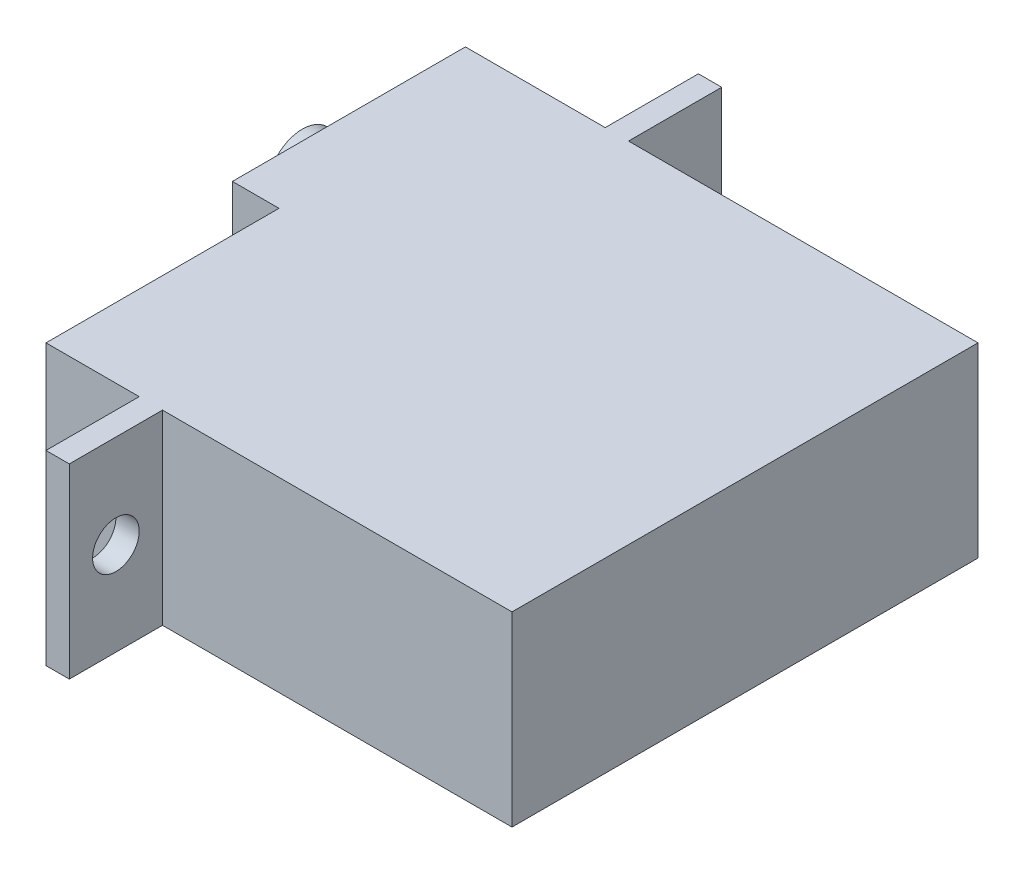
ISO-10303-21;
HEADER;
FILE_DESCRIPTION(('STEP AP214'),'2;1');
FILE_NAME('part.step','',(''),(''),'','','');
FILE_SCHEMA(('AUTOMOTIVE_DESIGN { 1 0 10303 214 1 1 1 1 }'));
ENDSEC;
DATA;
#1=APPLICATION_CONTEXT('core data for automotive mechanical design processes');
#2=APPLICATION_PROTOCOL_DEFINITION('international standard','automotive_design',2000,#1);
#3=PRODUCT_CONTEXT('',#1,'mechanical');
#4=PRODUCT('Part','Part','',(#3));
#5=PRODUCT_RELATED_PRODUCT_CATEGORY('part','',(#4));
#6=PRODUCT_DEFINITION_FORMATION('','',#4);
#7=PRODUCT_DEFINITION_CONTEXT('part definition',#1,'design');
#8=PRODUCT_DEFINITION('design','',#6,#7);
#9=PRODUCT_DEFINITION_SHAPE('','',#8);
#10=(LENGTH_UNIT() NAMED_UNIT(*) SI_UNIT(.MILLI.,.METRE.));
#11=(NAMED_UNIT(*) PLANE_ANGLE_UNIT() SI_UNIT($,.RADIAN.));
#12=(NAMED_UNIT(*) SI_UNIT($,.STERADIAN.) SOLID_ANGLE_UNIT());
#13=UNCERTAINTY_MEASURE_WITH_UNIT(LENGTH_MEASURE(1.E-05),#10,'distance_accuracy_value','');
#14=(GEOMETRIC_REPRESENTATION_CONTEXT(3) GLOBAL_UNCERTAINTY_ASSIGNED_CONTEXT((#13)) GLOBAL_UNIT_ASSIGNED_CONTEXT((#10,
#11,#12)) REPRESENTATION_CONTEXT('',''));
#15=CARTESIAN_POINT('',(0.,0.,0.));
#16=DIRECTION('',(0.,0.,1.));
#17=DIRECTION('',(1.,0.,0.));
#18=AXIS2_PLACEMENT_3D('',#15,#16,#17);
#19=CARTESIAN_POINT('',(0.,8.,0.));
#20=DIRECTION('',(1.,0.,0.));
#21=DIRECTION('',(0.,0.,-1.));
#22=AXIS2_PLACEMENT_3D('',#19,#20,#21);
#23=PLANE('',#22);
#24=DIRECTION('',(0.,1.,0.));
#25=VECTOR('',#24,1.);
#26=CARTESIAN_POINT('',(0.,8.,10.));
#27=LINE('',#26,#25);
#28=CARTESIAN_POINT('',(0.,0.,10.));
#29=VERTEX_POINT('',#28);
#30=CARTESIAN_POINT('',(0.,8.,10.));
#31=VERTEX_POINT('',#30);
#32=EDGE_CURVE('E49',#29,#31,#27,.T.);
#33=ORIENTED_EDGE('',*,*,#32,.F.);
#34=DIRECTION('',(0.,0.,1.));
#35=VECTOR('',#34,1.);
#36=CARTESIAN_POINT('',(0.,0.,0.));
#37=LINE('',#36,#35);
#38=CARTESIAN_POINT('',(0.,0.,20.));
#39=VERTEX_POINT('',#38);
#40=EDGE_CURVE('E233',#29,#39,#37,.T.);
#41=ORIENTED_EDGE('',*,*,#40,.T.);
#42=DIRECTION('',(0.,-1.,0.));
#43=VECTOR('',#42,1.);
#44=CARTESIAN_POINT('',(0.,8.,20.));
#45=LINE('',#44,#43);
#46=CARTESIAN_POINT('',(0.,8.,20.));
#47=VERTEX_POINT('',#46);
#48=EDGE_CURVE('E11',#47,#39,#45,.T.);
#49=ORIENTED_EDGE('',*,*,#48,.F.);
#50=DIRECTION('',(0.,0.,1.));
#51=VECTOR('',#50,1.);
#52=CARTESIAN_POINT('',(0.,8.,0.));
#53=LINE('',#52,#51);
#54=EDGE_CURVE('E234',#31,#47,#53,.T.);
#55=ORIENTED_EDGE('',*,*,#54,.F.);
#56=EDGE_LOOP('',(#33,#41,#49,#55));
#57=FACE_BOUND('',#56,.T.);
#58=ADVANCED_FACE('F34',(#57),#23,.F.);
#59=CARTESIAN_POINT('',(0.,8.,20.));
#60=DIRECTION('',(0.,0.,-1.));
#61=DIRECTION('',(-1.,0.,0.));
#62=AXIS2_PLACEMENT_3D('',#59,#60,#61);
#63=PLANE('',#62);
#64=DIRECTION('',(0.,-1.,0.));
#65=VECTOR('',#64,1.);
#66=CARTESIAN_POINT('',(4.,8.,20.));
#67=LINE('',#66,#65);
#68=CARTESIAN_POINT('',(4.00000000000001,8.,20.));
#69=VERTEX_POINT('',#68);
#70=CARTESIAN_POINT('',(4.00000000000001,0.,20.));
#71=VERTEX_POINT('',#70);
#72=EDGE_CURVE('E57',#69,#71,#67,.T.);
#73=ORIENTED_EDGE('',*,*,#72,.F.);
#74=DIRECTION('',(1.,0.,0.));
#75=VECTOR('',#74,1.);
#76=CARTESIAN_POINT('',(0.,8.,20.));
#77=LINE('',#76,#75);
#78=EDGE_CURVE('E237',#47,#69,#77,.T.);
#79=ORIENTED_EDGE('',*,*,#78,.F.);
#80=ORIENTED_EDGE('',*,*,#48,.T.);
#81=DIRECTION('',(1.,0.,0.));
#82=VECTOR('',#81,1.);
#83=CARTESIAN_POINT('',(0.,0.,20.));
#84=LINE('',#83,#82);
#85=EDGE_CURVE('E248',#39,#71,#84,.T.);
#86=ORIENTED_EDGE('',*,*,#85,.T.);
#87=EDGE_LOOP('',(#73,#79,#80,#86));
#88=FACE_BOUND('',#87,.T.);
#89=ADVANCED_FACE('F294',(#88),#63,.F.);
#90=DIRECTION('',(0.,1.,0.));
#91=VECTOR('',#90,1.);
#92=CARTESIAN_POINT('',(5.,8.,20.));
#93=LINE('',#92,#91);
#94=CARTESIAN_POINT('',(5.,0.,20.));
#95=VERTEX_POINT('',#94);
#96=CARTESIAN_POINT('',(5.,8.,20.));
#97=VERTEX_POINT('',#96);
#98=EDGE_CURVE('E188',#95,#97,#93,.T.);
#99=ORIENTED_EDGE('',*,*,#98,.F.);
#100=CARTESIAN_POINT('',(20.,0.,20.));
#101=VERTEX_POINT('',#100);
#102=EDGE_CURVE('E247',#95,#101,#84,.T.);
#103=ORIENTED_EDGE('',*,*,#102,.T.);
#104=DIRECTION('',(0.,-1.,0.));
#105=VECTOR('',#104,1.);
#106=CARTESIAN_POINT('',(20.,8.,20.));
#107=LINE('',#106,#105);
#108=CARTESIAN_POINT('',(20.,8.,20.));
#109=VERTEX_POINT('',#108);
#110=EDGE_CURVE('E42',#109,#101,#107,.T.);
#111=ORIENTED_EDGE('',*,*,#110,.F.);
#112=EDGE_CURVE('E236',#97,#109,#77,.T.);
#113=ORIENTED_EDGE('',*,*,#112,.F.);
#114=EDGE_LOOP('',(#99,#103,#111,#113));
#115=FACE_BOUND('',#114,.T.);
#116=ADVANCED_FACE('F298',(#115),#63,.F.);
#117=CARTESIAN_POINT('',(0.,8.,0.));
#118=DIRECTION('',(0.,0.,1.));
#119=DIRECTION('',(1.,0.,0.));
#120=AXIS2_PLACEMENT_3D('',#117,#118,#119);
#121=PLANE('',#120);
#122=DIRECTION('',(0.,-1.,0.));
#123=VECTOR('',#122,1.);
#124=CARTESIAN_POINT('',(5.,8.,0.));
#125=LINE('',#124,#123);
#126=CARTESIAN_POINT('',(5.,8.,0.));
#127=VERTEX_POINT('',#126);
#128=CARTESIAN_POINT('',(5.,0.,0.));
#129=VERTEX_POINT('',#128);
#130=EDGE_CURVE('E209',#127,#129,#125,.T.);
#131=ORIENTED_EDGE('',*,*,#130,.F.);
#132=DIRECTION('',(-1.,0.,0.));
#133=VECTOR('',#132,1.);
#134=CARTESIAN_POINT('',(0.,8.,0.));
#135=LINE('',#134,#133);
#136=CARTESIAN_POINT('',(20.,8.,0.));
#137=VERTEX_POINT('',#136);
#138=EDGE_CURVE('E242',#137,#127,#135,.T.);
#139=ORIENTED_EDGE('',*,*,#138,.F.);
#140=DIRECTION('',(0.,-1.,0.));
#141=VECTOR('',#140,1.);
#142=CARTESIAN_POINT('',(20.,8.,0.));
#143=LINE('',#142,#141);
#144=CARTESIAN_POINT('',(20.,0.,0.));
#145=VERTEX_POINT('',#144);
#146=EDGE_CURVE('E245',#137,#145,#143,.T.);
#147=ORIENTED_EDGE('',*,*,#146,.T.);
#148=DIRECTION('',(-1.,0.,0.));
#149=VECTOR('',#148,1.);
#150=CARTESIAN_POINT('',(0.,0.,0.));
#151=LINE('',#150,#149);
#152=EDGE_CURVE('E146',#145,#129,#151,.T.);
#153=ORIENTED_EDGE('',*,*,#152,.T.);
#154=EDGE_LOOP('',(#131,#139,#147,#153));
#155=FACE_BOUND('',#154,.T.);
#156=ADVANCED_FACE('F266',(#155),#121,.F.);
#157=DIRECTION('',(0.,1.,0.));
#158=VECTOR('',#157,1.);
#159=CARTESIAN_POINT('',(4.,8.,0.));
#160=LINE('',#159,#158);
#161=CARTESIAN_POINT('',(4.,0.,0.));
#162=VERTEX_POINT('',#161);
#163=CARTESIAN_POINT('',(4.,8.,0.));
#164=VERTEX_POINT('',#163);
#165=EDGE_CURVE('E142',#162,#164,#160,.T.);
#166=ORIENTED_EDGE('',*,*,#165,.F.);
#167=CARTESIAN_POINT('',(-2.,0.,0.));
#168=VERTEX_POINT('',#167);
#169=EDGE_CURVE('E136',#162,#168,#151,.T.);
#170=ORIENTED_EDGE('',*,*,#169,.T.);
#171=DIRECTION('',(0.,-1.,0.));
#172=VECTOR('',#171,1.);
#173=CARTESIAN_POINT('',(-2.,8.,0.));
#174=LINE('',#173,#172);
#175=CARTESIAN_POINT('',(-2.,8.,0.));
#176=VERTEX_POINT('',#175);
#177=EDGE_CURVE('E140',#176,#168,#174,.T.);
#178=ORIENTED_EDGE('',*,*,#177,.F.);
#179=EDGE_CURVE('E241',#164,#176,#135,.T.);
#180=ORIENTED_EDGE('',*,*,#179,.F.);
#181=EDGE_LOOP('',(#166,#170,#178,#180));
#182=FACE_BOUND('',#181,.T.);
#183=ADVANCED_FACE('F138',(#182),#121,.F.);
#184=CARTESIAN_POINT('',(20.,8.,0.));
#185=DIRECTION('',(-1.,0.,0.));
#186=DIRECTION('',(0.,0.,1.));
#187=AXIS2_PLACEMENT_3D('',#184,#185,#186);
#188=PLANE('',#187);
#189=DIRECTION('',(0.,0.,-1.));
#190=VECTOR('',#189,1.);
#191=CARTESIAN_POINT('',(20.,0.,0.));
#192=LINE('',#191,#190);
#193=EDGE_CURVE('E147',#101,#145,#192,.T.);
#194=ORIENTED_EDGE('',*,*,#193,.T.);
#195=ORIENTED_EDGE('',*,*,#146,.F.);
#196=DIRECTION('',(0.,0.,-1.));
#197=VECTOR('',#196,1.);
#198=CARTESIAN_POINT('',(20.,8.,0.));
#199=LINE('',#198,#197);
#200=EDGE_CURVE('E239',#109,#137,#199,.T.);
#201=ORIENTED_EDGE('',*,*,#200,.F.);
#202=ORIENTED_EDGE('',*,*,#110,.T.);
#203=EDGE_LOOP('',(#194,#195,#201,#202));
#204=FACE_BOUND('',#203,.T.);
#205=ADVANCED_FACE('F258',(#204),#188,.F.);
#206=CARTESIAN_POINT('',(0.,8.,0.));
#207=DIRECTION('',(0.,1.,0.));
#208=DIRECTION('',(0.,0.,1.));
#209=AXIS2_PLACEMENT_3D('',#206,#207,#208);
#210=PLANE('',#209);
#211=ORIENTED_EDGE('',*,*,#179,.T.);
#212=DIRECTION('',(0.,0.,-1.));
#213=VECTOR('',#212,1.);
#214=CARTESIAN_POINT('',(-2.,8.,0.));
#215=LINE('',#214,#213);
#216=CARTESIAN_POINT('',(-2.,8.,10.));
#217=VERTEX_POINT('',#216);
#218=EDGE_CURVE('E161',#217,#176,#215,.T.);
#219=ORIENTED_EDGE('',*,*,#218,.F.);
#220=DIRECTION('',(1.,0.,0.));
#221=VECTOR('',#220,1.);
#222=CARTESIAN_POINT('',(-2.,8.,10.));
#223=LINE('',#222,#221);
#224=EDGE_CURVE('E170',#217,#31,#223,.T.);
#225=ORIENTED_EDGE('',*,*,#224,.T.);
#226=ORIENTED_EDGE('',*,*,#54,.T.);
#227=ORIENTED_EDGE('',*,*,#78,.T.);
#228=DIRECTION('',(0.,0.,-1.));
#229=VECTOR('',#228,1.);
#230=CARTESIAN_POINT('',(4.,8.,24.));
#231=LINE('',#230,#229);
#232=CARTESIAN_POINT('',(4.,8.,24.));
#233=VERTEX_POINT('',#232);
#234=EDGE_CURVE('E194',#233,#69,#231,.T.);
#235=ORIENTED_EDGE('',*,*,#234,.F.);
#236=DIRECTION('',(-1.,0.,0.));
#237=VECTOR('',#236,1.);
#238=CARTESIAN_POINT('',(4.,8.,24.));
#239=LINE('',#238,#237);
#240=CARTESIAN_POINT('',(5.,8.,24.));
#241=VERTEX_POINT('',#240);
#242=EDGE_CURVE('E192',#241,#233,#239,.T.);
#243=ORIENTED_EDGE('',*,*,#242,.F.);
#244=DIRECTION('',(0.,0.,-1.));
#245=VECTOR('',#244,1.);
#246=CARTESIAN_POINT('',(5.,8.,24.));
#247=LINE('',#246,#245);
#248=EDGE_CURVE('E200',#241,#97,#247,.T.);
#249=ORIENTED_EDGE('',*,*,#248,.T.);
#250=ORIENTED_EDGE('',*,*,#112,.T.);
#251=ORIENTED_EDGE('',*,*,#200,.T.);
#252=ORIENTED_EDGE('',*,*,#138,.T.);
#253=DIRECTION('',(0.,0.,1.));
#254=VECTOR('',#253,1.);
#255=CARTESIAN_POINT('',(5.,8.,-4.));
#256=LINE('',#255,#254);
#257=CARTESIAN_POINT('',(5.,8.,-4.));
#258=VERTEX_POINT('',#257);
#259=EDGE_CURVE('E219',#258,#127,#256,.T.);
#260=ORIENTED_EDGE('',*,*,#259,.F.);
#261=DIRECTION('',(1.,0.,0.));
#262=VECTOR('',#261,1.);
#263=CARTESIAN_POINT('',(5.,8.,-4.));
#264=LINE('',#263,#262);
#265=CARTESIAN_POINT('',(4.,8.,-4.));
#266=VERTEX_POINT('',#265);
#267=EDGE_CURVE('E217',#266,#258,#264,.T.);
#268=ORIENTED_EDGE('',*,*,#267,.F.);
#269=DIRECTION('',(0.,0.,1.));
#270=VECTOR('',#269,1.);
#271=CARTESIAN_POINT('',(4.,8.,-4.));
#272=LINE('',#271,#270);
#273=EDGE_CURVE('E225',#266,#164,#272,.T.);
#274=ORIENTED_EDGE('',*,*,#273,.T.);
#275=EDGE_LOOP('',(#211,#219,#225,#226,#227,#235,#243,#249,#250,#251,#252,#260,#268,#274));
#276=FACE_BOUND('',#275,.T.);
#277=ADVANCED_FACE('F270',(#276),#210,.T.);
#278=CARTESIAN_POINT('',(0.,0.,0.));
#279=DIRECTION('',(0.,1.,0.));
#280=DIRECTION('',(0.,0.,1.));
#281=AXIS2_PLACEMENT_3D('',#278,#279,#280);
#282=PLANE('',#281);
#283=ORIENTED_EDGE('',*,*,#40,.F.);
#284=DIRECTION('',(1.,0.,0.));
#285=VECTOR('',#284,1.);
#286=CARTESIAN_POINT('',(-2.,0.,10.));
#287=LINE('',#286,#285);
#288=CARTESIAN_POINT('',(-2.,0.,10.));
#289=VERTEX_POINT('',#288);
#290=EDGE_CURVE('E153',#289,#29,#287,.T.);
#291=ORIENTED_EDGE('',*,*,#290,.F.);
#292=DIRECTION('',(0.,0.,1.));
#293=VECTOR('',#292,1.);
#294=CARTESIAN_POINT('',(-2.,0.,0.));
#295=LINE('',#294,#293);
#296=EDGE_CURVE('E150',#168,#289,#295,.T.);
#297=ORIENTED_EDGE('',*,*,#296,.F.);
#298=ORIENTED_EDGE('',*,*,#169,.F.);
#299=DIRECTION('',(0.,0.,1.));
#300=VECTOR('',#299,1.);
#301=CARTESIAN_POINT('',(4.,0.,-4.));
#302=LINE('',#301,#300);
#303=CARTESIAN_POINT('',(4.,0.,-4.));
#304=VERTEX_POINT('',#303);
#305=EDGE_CURVE('E228',#304,#162,#302,.T.);
#306=ORIENTED_EDGE('',*,*,#305,.F.);
#307=DIRECTION('',(-1.,0.,0.));
#308=VECTOR('',#307,1.);
#309=CARTESIAN_POINT('',(5.,0.,-4.));
#310=LINE('',#309,#308);
#311=CARTESIAN_POINT('',(5.,0.,-4.));
#312=VERTEX_POINT('',#311);
#313=EDGE_CURVE('E213',#312,#304,#310,.T.);
#314=ORIENTED_EDGE('',*,*,#313,.F.);
#315=DIRECTION('',(0.,0.,1.));
#316=VECTOR('',#315,1.);
#317=CARTESIAN_POINT('',(5.,0.,-4.));
#318=LINE('',#317,#316);
#319=EDGE_CURVE('E230',#312,#129,#318,.T.);
#320=ORIENTED_EDGE('',*,*,#319,.T.);
#321=ORIENTED_EDGE('',*,*,#152,.F.);
#322=ORIENTED_EDGE('',*,*,#193,.F.);
#323=ORIENTED_EDGE('',*,*,#102,.F.);
#324=DIRECTION('',(0.,0.,-1.));
#325=VECTOR('',#324,1.);
#326=CARTESIAN_POINT('',(5.00000000000001,0.,24.));
#327=LINE('',#326,#325);
#328=CARTESIAN_POINT('',(5.00000000000001,0.,24.));
#329=VERTEX_POINT('',#328);
#330=EDGE_CURVE('E203',#329,#95,#327,.T.);
#331=ORIENTED_EDGE('',*,*,#330,.F.);
#332=DIRECTION('',(1.,0.,0.));
#333=VECTOR('',#332,1.);
#334=CARTESIAN_POINT('',(4.00000000000001,0.,24.));
#335=LINE('',#334,#333);
#336=CARTESIAN_POINT('',(4.00000000000001,0.,24.));
#337=VERTEX_POINT('',#336);
#338=EDGE_CURVE('E187',#337,#329,#335,.T.);
#339=ORIENTED_EDGE('',*,*,#338,.F.);
#340=DIRECTION('',(0.,0.,-1.));
#341=VECTOR('',#340,1.);
#342=CARTESIAN_POINT('',(4.00000000000001,0.,24.));
#343=LINE('',#342,#341);
#344=EDGE_CURVE('E206',#337,#71,#343,.T.);
#345=ORIENTED_EDGE('',*,*,#344,.T.);
#346=ORIENTED_EDGE('',*,*,#85,.F.);
#347=EDGE_LOOP('',(#283,#291,#297,#298,#306,#314,#320,#321,#322,#323,#331,#339,#345,#346));
#348=FACE_BOUND('',#347,.T.);
#349=ADVANCED_FACE('F151',(#348),#282,.F.);
#350=CARTESIAN_POINT('',(5.,8.,-4.));
#351=DIRECTION('',(-1.,0.,0.));
#352=DIRECTION('',(0.,-1.,0.));
#353=AXIS2_PLACEMENT_3D('',#350,#351,#352);
#354=PLANE('',#353);
#355=CARTESIAN_POINT('',(5.,4.,-2.));
#356=DIRECTION('',(-1.,0.,0.));
#357=DIRECTION('',(0.,-1.,0.));
#358=AXIS2_PLACEMENT_3D('',#355,#356,#357);
#359=CIRCLE('',#358,1.);
#360=CARTESIAN_POINT('',(5.,3.,-2.));
#361=VERTEX_POINT('',#360);
#362=EDGE_CURVE('E181',#361,#361,#359,.T.);
#363=ORIENTED_EDGE('',*,*,#362,.T.);
#364=EDGE_LOOP('',(#363));
#365=FACE_BOUND('',#364,.T.);
#366=ORIENTED_EDGE('',*,*,#130,.T.);
#367=ORIENTED_EDGE('',*,*,#319,.F.);
#368=DIRECTION('',(0.,-1.,0.));
#369=VECTOR('',#368,1.);
#370=CARTESIAN_POINT('',(5.,8.,-4.));
#371=LINE('',#370,#369);
#372=EDGE_CURVE('E210',#258,#312,#371,.T.);
#373=ORIENTED_EDGE('',*,*,#372,.F.);
#374=ORIENTED_EDGE('',*,*,#259,.T.);
#375=EDGE_LOOP('',(#366,#367,#373,#374));
#376=FACE_BOUND('',#375,.T.);
#377=ADVANCED_FACE('F274',(#365,#376),#354,.F.);
#378=CARTESIAN_POINT('',(4.,8.,-4.));
#379=DIRECTION('',(1.,0.,0.));
#380=DIRECTION('',(0.,1.,0.));
#381=AXIS2_PLACEMENT_3D('',#378,#379,#380);
#382=PLANE('',#381);
#383=CARTESIAN_POINT('',(4.,4.,-2.));
#384=DIRECTION('',(-1.,0.,0.));
#385=DIRECTION('',(0.,-1.,0.));
#386=AXIS2_PLACEMENT_3D('',#383,#384,#385);
#387=CIRCLE('',#386,1.);
#388=CARTESIAN_POINT('',(4.,3.,-2.));
#389=VERTEX_POINT('',#388);
#390=EDGE_CURVE('E178',#389,#389,#387,.T.);
#391=ORIENTED_EDGE('',*,*,#390,.F.);
#392=EDGE_LOOP('',(#391));
#393=FACE_BOUND('',#392,.T.);
#394=ORIENTED_EDGE('',*,*,#165,.T.);
#395=ORIENTED_EDGE('',*,*,#273,.F.);
#396=DIRECTION('',(0.,1.,0.));
#397=VECTOR('',#396,1.);
#398=CARTESIAN_POINT('',(4.,8.,-4.));
#399=LINE('',#398,#397);
#400=EDGE_CURVE('E215',#304,#266,#399,.T.);
#401=ORIENTED_EDGE('',*,*,#400,.F.);
#402=ORIENTED_EDGE('',*,*,#305,.T.);
#403=EDGE_LOOP('',(#394,#395,#401,#402));
#404=FACE_BOUND('',#403,.T.);
#405=ADVANCED_FACE('F280',(#393,#404),#382,.F.);
#406=CARTESIAN_POINT('',(0.,0.,-4.));
#407=DIRECTION('',(0.,0.,-1.));
#408=DIRECTION('',(-1.,0.,0.));
#409=AXIS2_PLACEMENT_3D('',#406,#407,#408);
#410=PLANE('',#409);
#411=ORIENTED_EDGE('',*,*,#372,.T.);
#412=ORIENTED_EDGE('',*,*,#313,.T.);
#413=ORIENTED_EDGE('',*,*,#400,.T.);
#414=ORIENTED_EDGE('',*,*,#267,.T.);
#415=EDGE_LOOP('',(#411,#412,#413,#414));
#416=FACE_BOUND('',#415,.T.);
#417=ADVANCED_FACE('F276',(#416),#410,.T.);
#418=CARTESIAN_POINT('',(4.,8.,24.));
#419=DIRECTION('',(1.,0.,0.));
#420=DIRECTION('',(0.,1.,0.));
#421=AXIS2_PLACEMENT_3D('',#418,#419,#420);
#422=PLANE('',#421);
#423=CARTESIAN_POINT('',(4.,4.,22.));
#424=DIRECTION('',(-1.,0.,0.));
#425=DIRECTION('',(0.,-1.,0.));
#426=AXIS2_PLACEMENT_3D('',#423,#424,#425);
#427=CIRCLE('',#426,1.);
#428=CARTESIAN_POINT('',(4.,3.,22.));
#429=VERTEX_POINT('',#428);
#430=EDGE_CURVE('E175',#429,#429,#427,.T.);
#431=ORIENTED_EDGE('',*,*,#430,.F.);
#432=EDGE_LOOP('',(#431));
#433=FACE_BOUND('',#432,.T.);
#434=ORIENTED_EDGE('',*,*,#72,.T.);
#435=ORIENTED_EDGE('',*,*,#344,.F.);
#436=DIRECTION('',(0.,-1.,0.));
#437=VECTOR('',#436,1.);
#438=CARTESIAN_POINT('',(4.,8.,24.));
#439=LINE('',#438,#437);
#440=EDGE_CURVE('E184',#233,#337,#439,.T.);
#441=ORIENTED_EDGE('',*,*,#440,.F.);
#442=ORIENTED_EDGE('',*,*,#234,.T.);
#443=EDGE_LOOP('',(#434,#435,#441,#442));
#444=FACE_BOUND('',#443,.T.);
#445=ADVANCED_FACE('F288',(#433,#444),#422,.F.);
#446=CARTESIAN_POINT('',(5.,8.,24.));
#447=DIRECTION('',(-1.,0.,0.));
#448=DIRECTION('',(0.,-1.,0.));
#449=AXIS2_PLACEMENT_3D('',#446,#447,#448);
#450=PLANE('',#449);
#451=CARTESIAN_POINT('',(5.,4.,22.));
#452=DIRECTION('',(-1.,0.,0.));
#453=DIRECTION('',(0.,-1.,0.));
#454=AXIS2_PLACEMENT_3D('',#451,#452,#453);
#455=CIRCLE('',#454,1.);
#456=CARTESIAN_POINT('',(5.,3.,22.));
#457=VERTEX_POINT('',#456);
#458=EDGE_CURVE('E37',#457,#457,#455,.T.);
#459=ORIENTED_EDGE('',*,*,#458,.T.);
#460=EDGE_LOOP('',(#459));
#461=FACE_BOUND('',#460,.T.);
#462=ORIENTED_EDGE('',*,*,#98,.T.);
#463=ORIENTED_EDGE('',*,*,#248,.F.);
#464=DIRECTION('',(0.,1.,0.));
#465=VECTOR('',#464,1.);
#466=CARTESIAN_POINT('',(5.,8.,24.));
#467=LINE('',#466,#465);
#468=EDGE_CURVE('E190',#329,#241,#467,.T.);
#469=ORIENTED_EDGE('',*,*,#468,.F.);
#470=ORIENTED_EDGE('',*,*,#330,.T.);
#471=EDGE_LOOP('',(#462,#463,#469,#470));
#472=FACE_BOUND('',#471,.T.);
#473=ADVANCED_FACE('F346',(#461,#472),#450,.F.);
#474=CARTESIAN_POINT('',(0.,0.,24.));
#475=DIRECTION('',(0.,0.,1.));
#476=DIRECTION('',(1.,0.,0.));
#477=AXIS2_PLACEMENT_3D('',#474,#475,#476);
#478=PLANE('',#477);
#479=ORIENTED_EDGE('',*,*,#440,.T.);
#480=ORIENTED_EDGE('',*,*,#338,.T.);
#481=ORIENTED_EDGE('',*,*,#468,.T.);
#482=ORIENTED_EDGE('',*,*,#242,.T.);
#483=EDGE_LOOP('',(#479,#480,#481,#482));
#484=FACE_BOUND('',#483,.T.);
#485=ADVANCED_FACE('F332',(#484),#478,.T.);
#486=CARTESIAN_POINT('',(8.,4.,-2.));
#487=DIRECTION('',(-1.,0.,0.));
#488=DIRECTION('',(0.,-1.,0.));
#489=AXIS2_PLACEMENT_3D('',#486,#487,#488);
#490=CYLINDRICAL_SURFACE('',#489,1.);
#491=ORIENTED_EDGE('',*,*,#390,.T.);
#492=EDGE_LOOP('',(#491));
#493=FACE_BOUND('',#492,.T.);
#494=ORIENTED_EDGE('',*,*,#362,.F.);
#495=EDGE_LOOP('',(#494));
#496=FACE_BOUND('',#495,.T.);
#497=ADVANCED_FACE('F362',(#493,#496),#490,.F.);
#498=CARTESIAN_POINT('',(8.,4.,22.));
#499=DIRECTION('',(-1.,0.,0.));
#500=DIRECTION('',(0.,-1.,0.));
#501=AXIS2_PLACEMENT_3D('',#498,#499,#500);
#502=CYLINDRICAL_SURFACE('',#501,1.);
#503=ORIENTED_EDGE('',*,*,#430,.T.);
#504=EDGE_LOOP('',(#503));
#505=FACE_BOUND('',#504,.T.);
#506=ORIENTED_EDGE('',*,*,#458,.F.);
#507=EDGE_LOOP('',(#506));
#508=FACE_BOUND('',#507,.T.);
#509=ADVANCED_FACE('F367',(#505,#508),#502,.F.);
#510=CARTESIAN_POINT('',(-2.,8.,10.));
#511=DIRECTION('',(0.,0.,-1.));
#512=DIRECTION('',(0.,1.,0.));
#513=AXIS2_PLACEMENT_3D('',#510,#511,#512);
#514=PLANE('',#513);
#515=ORIENTED_EDGE('',*,*,#32,.T.);
#516=ORIENTED_EDGE('',*,*,#224,.F.);
#517=DIRECTION('',(0.,1.,0.));
#518=VECTOR('',#517,1.);
#519=CARTESIAN_POINT('',(-2.,8.,10.));
#520=LINE('',#519,#518);
#521=EDGE_CURVE('E156',#289,#217,#520,.T.);
#522=ORIENTED_EDGE('',*,*,#521,.F.);
#523=ORIENTED_EDGE('',*,*,#290,.T.);
#524=EDGE_LOOP('',(#515,#516,#522,#523));
#525=FACE_BOUND('',#524,.T.);
#526=ADVANCED_FACE('F376',(#525),#514,.F.);
#527=CARTESIAN_POINT('',(-2.,0.,0.));
#528=DIRECTION('',(-1.,0.,0.));
#529=DIRECTION('',(0.,0.,1.));
#530=AXIS2_PLACEMENT_3D('',#527,#528,#529);
#531=PLANE('',#530);
#532=CARTESIAN_POINT('',(-2.,3.94462720689268,4.));
#533=DIRECTION('',(-1.,0.,0.));
#534=DIRECTION('',(0.,0.,1.));
#535=AXIS2_PLACEMENT_3D('',#532,#533,#534);
#536=CIRCLE('',#535,1.5);
#537=CARTESIAN_POINT('',(-2.,3.94462720689268,5.5));
#538=VERTEX_POINT('',#537);
#539=EDGE_CURVE('E166',#538,#538,#536,.T.);
#540=ORIENTED_EDGE('',*,*,#539,.F.);
#541=EDGE_LOOP('',(#540));
#542=FACE_BOUND('',#541,.T.);
#543=ORIENTED_EDGE('',*,*,#177,.T.);
#544=ORIENTED_EDGE('',*,*,#296,.T.);
#545=ORIENTED_EDGE('',*,*,#521,.T.);
#546=ORIENTED_EDGE('',*,*,#218,.T.);
#547=EDGE_LOOP('',(#543,#544,#545,#546));
#548=FACE_BOUND('',#547,.T.);
#549=ADVANCED_FACE('F159',(#542,#548),#531,.T.);
#550=CARTESIAN_POINT('',(-5.,3.94462720689268,4.));
#551=DIRECTION('',(1.,0.,0.));
#552=DIRECTION('',(0.,0.,-1.));
#553=AXIS2_PLACEMENT_3D('',#550,#551,#552);
#554=CYLINDRICAL_SURFACE('',#553,1.5);
#555=CARTESIAN_POINT('',(-5.,3.94462720689268,4.));
#556=DIRECTION('',(-1.,0.,0.));
#557=DIRECTION('',(0.,0.,1.));
#558=AXIS2_PLACEMENT_3D('',#555,#556,#557);
#559=CIRCLE('',#558,1.5);
#560=CARTESIAN_POINT('',(-5.,3.94462720689268,5.5));
#561=VERTEX_POINT('',#560);
#562=EDGE_CURVE('E163',#561,#561,#559,.T.);
#563=ORIENTED_EDGE('',*,*,#562,.F.);
#564=EDGE_LOOP('',(#563));
#565=FACE_BOUND('',#564,.T.);
#566=ORIENTED_EDGE('',*,*,#539,.T.);
#567=EDGE_LOOP('',(#566));
#568=FACE_BOUND('',#567,.T.);
#569=ADVANCED_FACE('F439',(#565,#568),#554,.T.);
#570=CARTESIAN_POINT('',(-5.,3.94462720689268,4.));
#571=DIRECTION('',(-1.,0.,0.));
#572=DIRECTION('',(0.,0.,1.));
#573=AXIS2_PLACEMENT_3D('',#570,#571,#572);
#574=PLANE('',#573);
#575=ORIENTED_EDGE('',*,*,#562,.T.);
#576=EDGE_LOOP('',(#575));
#577=FACE_BOUND('',#576,.T.);
#578=ADVANCED_FACE('F448',(#577),#574,.T.);
#579=CLOSED_SHELL('',(#58,#89,#116,#156,#183,#205,#277,#349,#377,#405,#417,#445,#473,#485,#497,
#509,#526,#549,#569,#578));
#580=MANIFOLD_SOLID_BREP('B2',#579);
#581=ADVANCED_BREP_SHAPE_REPRESENTATION('',(#18,#580),#14);
#582=SHAPE_DEFINITION_REPRESENTATION(#9,#581);
ENDSEC;
END-ISO-10303-21;
